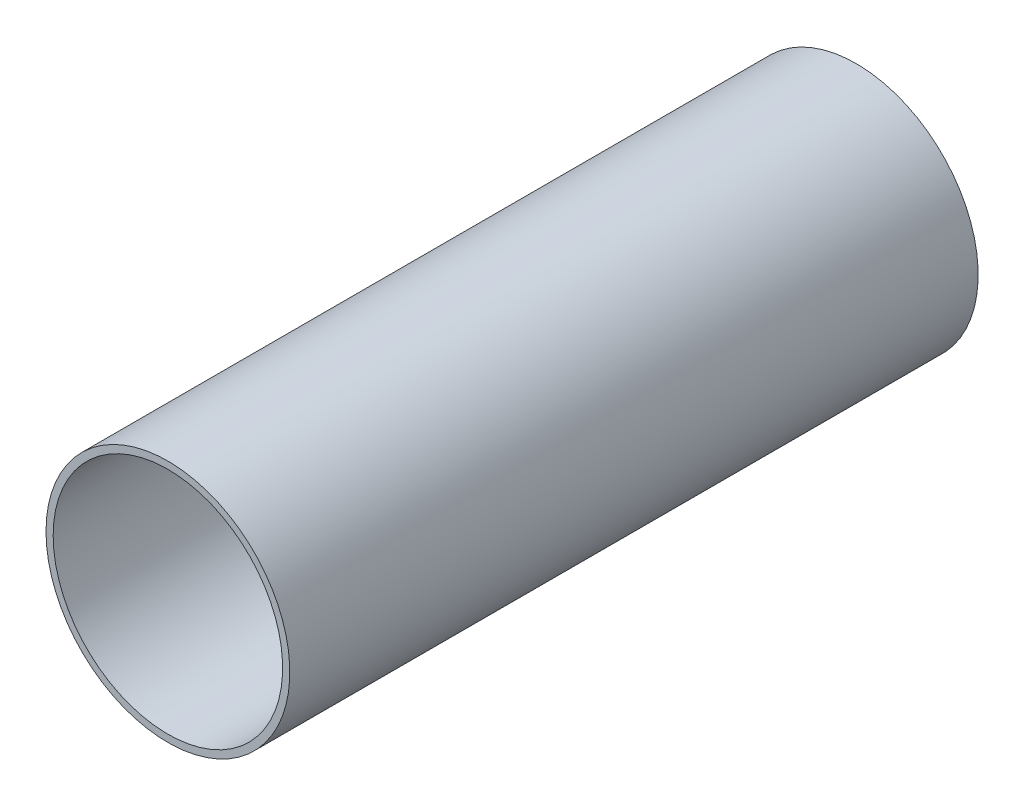
ISO-10303-21;
HEADER;
FILE_DESCRIPTION(('STEP AP214'),'2;1');
FILE_NAME('part.step','',(''),(''),'','','');
FILE_SCHEMA(('AUTOMOTIVE_DESIGN { 1 0 10303 214 1 1 1 1 }'));
ENDSEC;
DATA;
#1=APPLICATION_CONTEXT('core data for automotive mechanical design processes');
#2=APPLICATION_PROTOCOL_DEFINITION('international standard','automotive_design',2000,#1);
#3=PRODUCT_CONTEXT('',#1,'mechanical');
#4=PRODUCT('Part','Part','',(#3));
#5=PRODUCT_RELATED_PRODUCT_CATEGORY('part','',(#4));
#6=PRODUCT_DEFINITION_FORMATION('','',#4);
#7=PRODUCT_DEFINITION_CONTEXT('part definition',#1,'design');
#8=PRODUCT_DEFINITION('design','',#6,#7);
#9=PRODUCT_DEFINITION_SHAPE('','',#8);
#10=(LENGTH_UNIT() NAMED_UNIT(*) SI_UNIT(.MILLI.,.METRE.));
#11=(NAMED_UNIT(*) PLANE_ANGLE_UNIT() SI_UNIT($,.RADIAN.));
#12=(NAMED_UNIT(*) SI_UNIT($,.STERADIAN.) SOLID_ANGLE_UNIT());
#13=UNCERTAINTY_MEASURE_WITH_UNIT(LENGTH_MEASURE(1.E-05),#10,'distance_accuracy_value','');
#14=(GEOMETRIC_REPRESENTATION_CONTEXT(3) GLOBAL_UNCERTAINTY_ASSIGNED_CONTEXT((#13)) GLOBAL_UNIT_ASSIGNED_CONTEXT((#10,
#11,#12)) REPRESENTATION_CONTEXT('',''));
#15=CARTESIAN_POINT('',(0.,0.,0.));
#16=DIRECTION('',(0.,0.,1.));
#17=DIRECTION('',(1.,0.,0.));
#18=AXIS2_PLACEMENT_3D('',#15,#16,#17);
#19=CARTESIAN_POINT('',(0.,0.,609.6));
#20=DIRECTION('',(0.,0.,1.));
#21=DIRECTION('',(1.,0.,0.));
#22=AXIS2_PLACEMENT_3D('',#19,#20,#21);
#23=PLANE('',#22);
#24=CARTESIAN_POINT('',(0.,0.,609.6));
#25=DIRECTION('',(0.,0.,1.));
#26=DIRECTION('',(1.,0.,0.));
#27=AXIS2_PLACEMENT_3D('',#24,#25,#26);
#28=CIRCLE('',#27,107.95);
#29=CARTESIAN_POINT('',(-107.95,0.,609.6));
#30=VERTEX_POINT('',#29);
#31=EDGE_CURVE('E10',#30,#30,#28,.T.);
#32=ORIENTED_EDGE('',*,*,#31,.T.);
#33=EDGE_LOOP('',(#32));
#34=FACE_BOUND('',#33,.T.);
#35=CARTESIAN_POINT('',(0.,0.,609.6));
#36=DIRECTION('',(0.,0.,1.));
#37=DIRECTION('',(1.,0.,0.));
#38=AXIS2_PLACEMENT_3D('',#35,#36,#37);
#39=CIRCLE('',#38,101.6);
#40=CARTESIAN_POINT('',(-101.6,0.,609.6));
#41=VERTEX_POINT('',#40);
#42=EDGE_CURVE('E42',#41,#41,#39,.T.);
#43=ORIENTED_EDGE('',*,*,#42,.F.);
#44=EDGE_LOOP('',(#43));
#45=FACE_BOUND('',#44,.T.);
#46=ADVANCED_FACE('F31',(#34,#45),#23,.T.);
#47=CARTESIAN_POINT('',(0.,0.,0.));
#48=DIRECTION('',(0.,0.,1.));
#49=DIRECTION('',(1.,0.,0.));
#50=AXIS2_PLACEMENT_3D('',#47,#48,#49);
#51=PLANE('',#50);
#52=CARTESIAN_POINT('',(0.,0.,0.));
#53=DIRECTION('',(0.,0.,1.));
#54=DIRECTION('',(1.,0.,0.));
#55=AXIS2_PLACEMENT_3D('',#52,#53,#54);
#56=CIRCLE('',#55,107.95);
#57=CARTESIAN_POINT('',(-107.95,0.,0.));
#58=VERTEX_POINT('',#57);
#59=EDGE_CURVE('E35',#58,#58,#56,.T.);
#60=ORIENTED_EDGE('',*,*,#59,.F.);
#61=EDGE_LOOP('',(#60));
#62=FACE_BOUND('',#61,.T.);
#63=CARTESIAN_POINT('',(0.,0.,0.));
#64=DIRECTION('',(0.,0.,1.));
#65=DIRECTION('',(1.,0.,0.));
#66=AXIS2_PLACEMENT_3D('',#63,#64,#65);
#67=CIRCLE('',#66,101.6);
#68=CARTESIAN_POINT('',(-101.6,0.,0.));
#69=VERTEX_POINT('',#68);
#70=EDGE_CURVE('E44',#69,#69,#67,.T.);
#71=ORIENTED_EDGE('',*,*,#70,.T.);
#72=EDGE_LOOP('',(#71));
#73=FACE_BOUND('',#72,.T.);
#74=ADVANCED_FACE('F54',(#62,#73),#51,.F.);
#75=CARTESIAN_POINT('',(0.,0.,609.6));
#76=DIRECTION('',(0.,0.,-1.));
#77=DIRECTION('',(-1.,0.,0.));
#78=AXIS2_PLACEMENT_3D('',#75,#76,#77);
#79=CYLINDRICAL_SURFACE('',#78,107.95);
#80=CARTESIAN_POINT('',(-107.95,0.,609.6));
#81=CARTESIAN_POINT('',(-107.95,0.,603.25));
#82=CARTESIAN_POINT('',(-107.95,0.,596.9));
#83=CARTESIAN_POINT('',(-107.95,0.,584.2));
#84=CARTESIAN_POINT('',(-107.95,0.,577.85));
#85=CARTESIAN_POINT('',(-107.95,0.,565.15));
#86=CARTESIAN_POINT('',(-107.95,0.,558.8));
#87=CARTESIAN_POINT('',(-107.95,0.,546.1));
#88=CARTESIAN_POINT('',(-107.95,0.,539.75));
#89=CARTESIAN_POINT('',(-107.95,0.,527.05));
#90=CARTESIAN_POINT('',(-107.95,0.,520.7));
#91=CARTESIAN_POINT('',(-107.95,0.,508.));
#92=CARTESIAN_POINT('',(-107.95,0.,501.65));
#93=CARTESIAN_POINT('',(-107.95,0.,488.95));
#94=CARTESIAN_POINT('',(-107.95,0.,482.6));
#95=CARTESIAN_POINT('',(-107.95,0.,469.9));
#96=CARTESIAN_POINT('',(-107.95,0.,463.55));
#97=CARTESIAN_POINT('',(-107.95,0.,450.85));
#98=CARTESIAN_POINT('',(-107.95,0.,444.5));
#99=CARTESIAN_POINT('',(-107.95,0.,431.8));
#100=CARTESIAN_POINT('',(-107.95,0.,425.45));
#101=CARTESIAN_POINT('',(-107.95,0.,412.75));
#102=CARTESIAN_POINT('',(-107.95,0.,406.4));
#103=CARTESIAN_POINT('',(-107.95,0.,393.7));
#104=CARTESIAN_POINT('',(-107.95,0.,387.35));
#105=CARTESIAN_POINT('',(-107.95,0.,374.65));
#106=CARTESIAN_POINT('',(-107.95,0.,368.3));
#107=CARTESIAN_POINT('',(-107.95,0.,355.6));
#108=CARTESIAN_POINT('',(-107.95,0.,349.25));
#109=CARTESIAN_POINT('',(-107.95,0.,336.55));
#110=CARTESIAN_POINT('',(-107.95,0.,330.2));
#111=CARTESIAN_POINT('',(-107.95,0.,317.5));
#112=CARTESIAN_POINT('',(-107.95,0.,311.15));
#113=CARTESIAN_POINT('',(-107.95,0.,298.45));
#114=CARTESIAN_POINT('',(-107.95,0.,292.1));
#115=CARTESIAN_POINT('',(-107.95,0.,279.4));
#116=CARTESIAN_POINT('',(-107.95,0.,273.05));
#117=CARTESIAN_POINT('',(-107.95,0.,260.35));
#118=CARTESIAN_POINT('',(-107.95,0.,254.));
#119=CARTESIAN_POINT('',(-107.95,0.,241.3));
#120=CARTESIAN_POINT('',(-107.95,0.,234.95));
#121=CARTESIAN_POINT('',(-107.95,0.,222.25));
#122=CARTESIAN_POINT('',(-107.95,0.,215.9));
#123=CARTESIAN_POINT('',(-107.95,0.,203.2));
#124=CARTESIAN_POINT('',(-107.95,0.,196.85));
#125=CARTESIAN_POINT('',(-107.95,0.,184.15));
#126=CARTESIAN_POINT('',(-107.95,0.,177.8));
#127=CARTESIAN_POINT('',(-107.95,0.,165.1));
#128=CARTESIAN_POINT('',(-107.95,0.,158.75));
#129=CARTESIAN_POINT('',(-107.95,0.,146.05));
#130=CARTESIAN_POINT('',(-107.95,0.,139.7));
#131=CARTESIAN_POINT('',(-107.95,0.,127.));
#132=CARTESIAN_POINT('',(-107.95,0.,120.65));
#133=CARTESIAN_POINT('',(-107.95,0.,107.95));
#134=CARTESIAN_POINT('',(-107.95,0.,101.6));
#135=CARTESIAN_POINT('',(-107.95,0.,88.9));
#136=CARTESIAN_POINT('',(-107.95,0.,82.5500000000001));
#137=CARTESIAN_POINT('',(-107.95,0.,69.85));
#138=CARTESIAN_POINT('',(-107.95,0.,63.5));
#139=CARTESIAN_POINT('',(-107.95,0.,50.8));
#140=CARTESIAN_POINT('',(-107.95,0.,44.45));
#141=CARTESIAN_POINT('',(-107.95,0.,31.75));
#142=CARTESIAN_POINT('',(-107.95,0.,25.4));
#143=CARTESIAN_POINT('',(-107.95,0.,12.7));
#144=CARTESIAN_POINT('',(-107.95,0.,6.35000000000001));
#145=CARTESIAN_POINT('',(-107.95,0.,0.));
#146=B_SPLINE_CURVE_WITH_KNOTS('',3,(#80,#81,#82,#83,#84,#85,#86,#87,#88,#89,#90,#91,#92,#93,
#94,#95,#96,#97,#98,#99,#100,#101,#102,#103,#104,#105,#106,#107,#108,#109,#110,#111,#112,#113,
#114,#115,#116,#117,#118,#119,#120,#121,#122,#123,#124,#125,#126,#127,#128,#129,#130,#131,#132,
#133,#134,#135,#136,#137,#138,#139,#140,#141,#142,#143,#144,#145),.UNSPECIFIED.,.F.,.F.,(4,2,2,
2,2,2,2,2,2,2,2,2,2,2,2,2,2,2,2,2,2,2,2,2,2,2,2,2,2,2,2,2,4),(0.,19.05,38.1,57.15,76.2,
95.2500000000001,114.3,133.35,152.4,171.45,190.5,209.55,228.6,247.65,266.7,285.75,304.8,323.85,
342.9,361.95,381.,400.05,419.1,438.15,457.2,476.25,495.3,514.35,533.4,552.45,571.5,590.55,
609.6),.UNSPECIFIED.);
#147=EDGE_CURVE('BSEAM33',#30,#58,#146,.T.);
#148=ORIENTED_EDGE('',*,*,#31,.F.);
#149=ORIENTED_EDGE('',*,*,#59,.T.);
#150=ORIENTED_EDGE('',*,*,#147,.T.);
#151=ORIENTED_EDGE('',*,*,#147,.F.);
#152=EDGE_LOOP('',(#148,#150,#149,#151));
#153=FACE_BOUND('',#152,.T.);
#154=ADVANCED_FACE('F33',(#153),#79,.T.);
#155=CARTESIAN_POINT('',(0.,0.,609.6));
#156=DIRECTION('',(0.,0.,-1.));
#157=DIRECTION('',(-1.,0.,0.));
#158=AXIS2_PLACEMENT_3D('',#155,#156,#157);
#159=CYLINDRICAL_SURFACE('',#158,101.6);
#160=CARTESIAN_POINT('',(-101.6,0.,609.6));
#161=CARTESIAN_POINT('',(-101.6,0.,603.25));
#162=CARTESIAN_POINT('',(-101.6,0.,596.9));
#163=CARTESIAN_POINT('',(-101.6,0.,584.2));
#164=CARTESIAN_POINT('',(-101.6,0.,577.85));
#165=CARTESIAN_POINT('',(-101.6,0.,565.15));
#166=CARTESIAN_POINT('',(-101.6,0.,558.8));
#167=CARTESIAN_POINT('',(-101.6,0.,546.1));
#168=CARTESIAN_POINT('',(-101.6,0.,539.75));
#169=CARTESIAN_POINT('',(-101.6,0.,527.05));
#170=CARTESIAN_POINT('',(-101.6,0.,520.7));
#171=CARTESIAN_POINT('',(-101.6,0.,508.));
#172=CARTESIAN_POINT('',(-101.6,0.,501.65));
#173=CARTESIAN_POINT('',(-101.6,0.,488.95));
#174=CARTESIAN_POINT('',(-101.6,0.,482.6));
#175=CARTESIAN_POINT('',(-101.6,0.,469.9));
#176=CARTESIAN_POINT('',(-101.6,0.,463.55));
#177=CARTESIAN_POINT('',(-101.6,0.,450.85));
#178=CARTESIAN_POINT('',(-101.6,0.,444.5));
#179=CARTESIAN_POINT('',(-101.6,0.,431.8));
#180=CARTESIAN_POINT('',(-101.6,0.,425.45));
#181=CARTESIAN_POINT('',(-101.6,0.,412.75));
#182=CARTESIAN_POINT('',(-101.6,0.,406.4));
#183=CARTESIAN_POINT('',(-101.6,0.,393.7));
#184=CARTESIAN_POINT('',(-101.6,0.,387.35));
#185=CARTESIAN_POINT('',(-101.6,0.,374.65));
#186=CARTESIAN_POINT('',(-101.6,0.,368.3));
#187=CARTESIAN_POINT('',(-101.6,0.,355.6));
#188=CARTESIAN_POINT('',(-101.6,0.,349.25));
#189=CARTESIAN_POINT('',(-101.6,0.,336.55));
#190=CARTESIAN_POINT('',(-101.6,0.,330.2));
#191=CARTESIAN_POINT('',(-101.6,0.,317.5));
#192=CARTESIAN_POINT('',(-101.6,0.,311.15));
#193=CARTESIAN_POINT('',(-101.6,0.,298.45));
#194=CARTESIAN_POINT('',(-101.6,0.,292.1));
#195=CARTESIAN_POINT('',(-101.6,0.,279.4));
#196=CARTESIAN_POINT('',(-101.6,0.,273.05));
#197=CARTESIAN_POINT('',(-101.6,0.,260.35));
#198=CARTESIAN_POINT('',(-101.6,0.,254.));
#199=CARTESIAN_POINT('',(-101.6,0.,241.3));
#200=CARTESIAN_POINT('',(-101.6,0.,234.95));
#201=CARTESIAN_POINT('',(-101.6,0.,222.25));
#202=CARTESIAN_POINT('',(-101.6,0.,215.9));
#203=CARTESIAN_POINT('',(-101.6,0.,203.2));
#204=CARTESIAN_POINT('',(-101.6,0.,196.85));
#205=CARTESIAN_POINT('',(-101.6,0.,184.15));
#206=CARTESIAN_POINT('',(-101.6,0.,177.8));
#207=CARTESIAN_POINT('',(-101.6,0.,165.1));
#208=CARTESIAN_POINT('',(-101.6,0.,158.75));
#209=CARTESIAN_POINT('',(-101.6,0.,146.05));
#210=CARTESIAN_POINT('',(-101.6,0.,139.7));
#211=CARTESIAN_POINT('',(-101.6,0.,127.));
#212=CARTESIAN_POINT('',(-101.6,0.,120.65));
#213=CARTESIAN_POINT('',(-101.6,0.,107.95));
#214=CARTESIAN_POINT('',(-101.6,0.,101.6));
#215=CARTESIAN_POINT('',(-101.6,0.,88.9));
#216=CARTESIAN_POINT('',(-101.6,0.,82.5500000000001));
#217=CARTESIAN_POINT('',(-101.6,0.,69.85));
#218=CARTESIAN_POINT('',(-101.6,0.,63.5));
#219=CARTESIAN_POINT('',(-101.6,0.,50.8));
#220=CARTESIAN_POINT('',(-101.6,0.,44.45));
#221=CARTESIAN_POINT('',(-101.6,0.,31.75));
#222=CARTESIAN_POINT('',(-101.6,0.,25.4));
#223=CARTESIAN_POINT('',(-101.6,0.,12.7));
#224=CARTESIAN_POINT('',(-101.6,0.,6.35000000000001));
#225=CARTESIAN_POINT('',(-101.6,0.,0.));
#226=B_SPLINE_CURVE_WITH_KNOTS('',3,(#160,#161,#162,#163,#164,#165,#166,#167,#168,#169,#170,
#171,#172,#173,#174,#175,#176,#177,#178,#179,#180,#181,#182,#183,#184,#185,#186,#187,#188,#189,
#190,#191,#192,#193,#194,#195,#196,#197,#198,#199,#200,#201,#202,#203,#204,#205,#206,#207,#208,
#209,#210,#211,#212,#213,#214,#215,#216,#217,#218,#219,#220,#221,#222,#223,#224,#225),
.UNSPECIFIED.,.F.,.F.,(4,2,2,2,2,2,2,2,2,2,2,2,2,2,2,2,2,2,2,2,2,2,2,2,2,2,2,2,2,2,2,2,4),(0.,
19.0499999999999,38.0999999999999,57.1499999999999,76.1999999999999,95.2499999999999,114.3,
133.35,152.4,171.45,190.5,209.55,228.6,247.65,266.7,285.75,304.8,323.85,342.9,361.95,381.,
400.05,419.1,438.15,457.2,476.25,495.3,514.35,533.4,552.45,571.5,590.55,609.6),.UNSPECIFIED.);
#227=EDGE_CURVE('BSEAM50',#41,#69,#226,.T.);
#228=ORIENTED_EDGE('',*,*,#42,.T.);
#229=ORIENTED_EDGE('',*,*,#70,.F.);
#230=ORIENTED_EDGE('',*,*,#227,.T.);
#231=ORIENTED_EDGE('',*,*,#227,.F.);
#232=EDGE_LOOP('',(#228,#230,#229,#231));
#233=FACE_BOUND('',#232,.T.);
#234=ADVANCED_FACE('F50',(#233),#159,.F.);
#235=CLOSED_SHELL('',(#46,#74,#154,#234));
#236=MANIFOLD_SOLID_BREP('B2',#235);
#237=ADVANCED_BREP_SHAPE_REPRESENTATION('',(#18,#236),#14);
#238=SHAPE_DEFINITION_REPRESENTATION(#9,#237);
ENDSEC;
END-ISO-10303-21;
